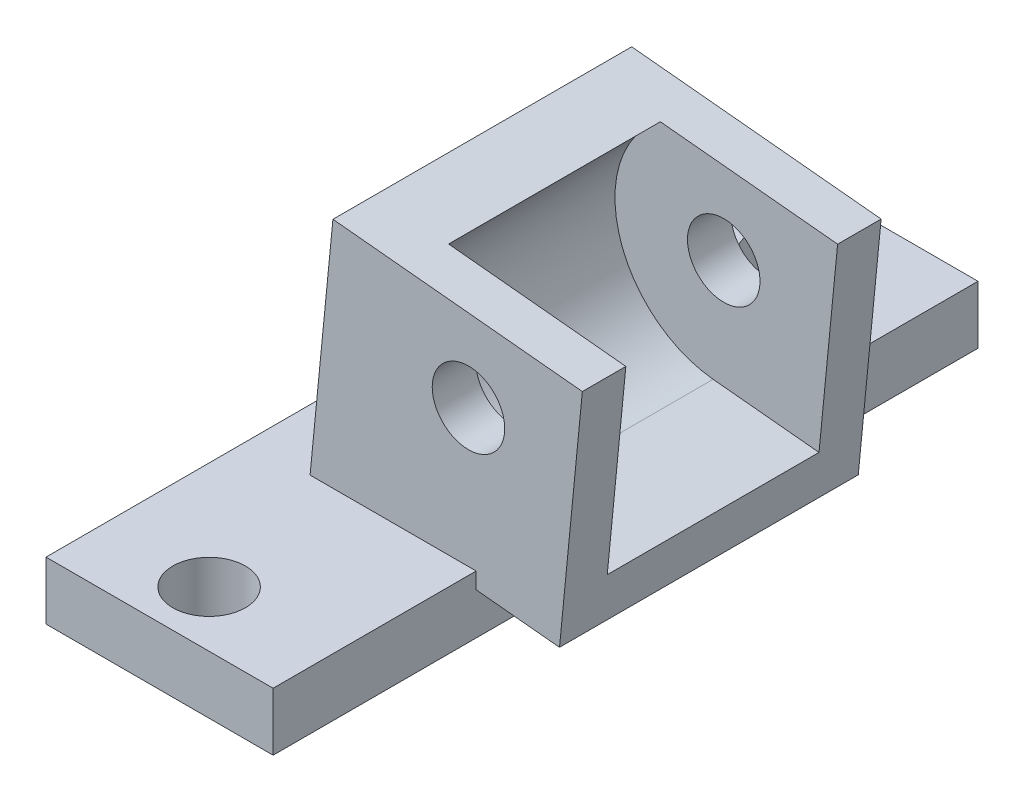
ISO-10303-21;
HEADER;
FILE_DESCRIPTION(('STEP AP214'),'2;1');
FILE_NAME('part.step','',(''),(''),'','','');
FILE_SCHEMA(('AUTOMOTIVE_DESIGN { 1 0 10303 214 1 1 1 1 }'));
ENDSEC;
DATA;
#1=APPLICATION_CONTEXT('core data for automotive mechanical design processes');
#2=APPLICATION_PROTOCOL_DEFINITION('international standard','automotive_design',2000,#1);
#3=PRODUCT_CONTEXT('',#1,'mechanical');
#4=PRODUCT('Part','Part','',(#3));
#5=PRODUCT_RELATED_PRODUCT_CATEGORY('part','',(#4));
#6=PRODUCT_DEFINITION_FORMATION('','',#4);
#7=PRODUCT_DEFINITION_CONTEXT('part definition',#1,'design');
#8=PRODUCT_DEFINITION('design','',#6,#7);
#9=PRODUCT_DEFINITION_SHAPE('','',#8);
#10=(LENGTH_UNIT() NAMED_UNIT(*) SI_UNIT(.MILLI.,.METRE.));
#11=(NAMED_UNIT(*) PLANE_ANGLE_UNIT() SI_UNIT($,.RADIAN.));
#12=(NAMED_UNIT(*) SI_UNIT($,.STERADIAN.) SOLID_ANGLE_UNIT());
#13=UNCERTAINTY_MEASURE_WITH_UNIT(LENGTH_MEASURE(1.E-05),#10,'distance_accuracy_value','');
#14=(GEOMETRIC_REPRESENTATION_CONTEXT(3) GLOBAL_UNCERTAINTY_ASSIGNED_CONTEXT((#13)) GLOBAL_UNIT_ASSIGNED_CONTEXT((#10,
#11,#12)) REPRESENTATION_CONTEXT('',''));
#15=CARTESIAN_POINT('',(0.,0.,0.));
#16=DIRECTION('',(0.,0.,1.));
#17=DIRECTION('',(1.,0.,0.));
#18=AXIS2_PLACEMENT_3D('',#15,#16,#17);
#19=CARTESIAN_POINT('',(-484.354931301938,150.999999999998,-22.352));
#20=DIRECTION('',(0.,0.,1.));
#21=DIRECTION('',(1.,0.,0.));
#22=AXIS2_PLACEMENT_3D('',#19,#20,#21);
#23=CYLINDRICAL_SURFACE('',#22,9.525);
#24=CARTESIAN_POINT('',(-484.354931301938,150.999999999998,-18.542));
#25=DIRECTION('',(0.,0.,-1.));
#26=DIRECTION('',(-1.,0.,0.));
#27=AXIS2_PLACEMENT_3D('',#24,#25,#26);
#28=CIRCLE('',#27,9.525);
#29=CARTESIAN_POINT('',(-489.904354663161,158.741416237219,-18.542));
#30=VERTEX_POINT('',#29);
#31=CARTESIAN_POINT('',(-485.284620904234,141.520479851626,-18.542));
#32=VERTEX_POINT('',#31);
#33=EDGE_CURVE('E263',#30,#32,#28,.F.);
#34=ORIENTED_EDGE('',*,*,#33,.F.);
#35=DIRECTION('',(0.,0.,1.));
#36=VECTOR('',#35,1.);
#37=CARTESIAN_POINT('',(-489.904354663161,158.741416237219,-22.352));
#38=LINE('',#37,#36);
#39=CARTESIAN_POINT('',(-489.904354663163,158.741416237217,0.));
#40=VERTEX_POINT('',#39);
#41=EDGE_CURVE('E287',#30,#40,#38,.T.);
#42=ORIENTED_EDGE('',*,*,#41,.T.);
#43=CARTESIAN_POINT('',(-484.354931301938,150.999999999998,0.));
#44=DIRECTION('',(0.,0.,1.));
#45=DIRECTION('',(1.,0.,0.));
#46=AXIS2_PLACEMENT_3D('',#43,#44,#45);
#47=CIRCLE('',#46,9.525);
#48=CARTESIAN_POINT('',(-485.284620904234,141.520479851626,0.));
#49=VERTEX_POINT('',#48);
#50=EDGE_CURVE('E273',#40,#49,#47,.T.);
#51=ORIENTED_EDGE('',*,*,#50,.T.);
#52=DIRECTION('',(0.,0.,1.));
#53=VECTOR('',#52,1.);
#54=CARTESIAN_POINT('',(-485.284620904234,141.520479851626,-22.352));
#55=LINE('',#54,#53);
#56=EDGE_CURVE('E294',#32,#49,#55,.T.);
#57=ORIENTED_EDGE('',*,*,#56,.F.);
#58=EDGE_LOOP('',(#34,#42,#51,#57));
#59=FACE_BOUND('',#58,.T.);
#60=ADVANCED_FACE('F47',(#59),#23,.F.);
#61=CARTESIAN_POINT('',(9.12398287906905,93.0321037493761,-22.352));
#62=DIRECTION('',(-0.0976052075901477,-0.995225212427461,0.));
#63=DIRECTION('',(0.995225212427461,-0.0976052075901477,0.));
#64=AXIS2_PLACEMENT_3D('',#61,#62,#63);
#65=PLANE('',#64);
#66=DIRECTION('',(0.995225212427461,-0.0976052075901477,0.));
#67=VECTOR('',#66,1.);
#68=CARTESIAN_POINT('',(9.12398287906905,93.0321037493761,-18.542));
#69=LINE('',#68,#67);
#70=CARTESIAN_POINT('',(-476.012545359688,140.611135065123,-18.542));
#71=VERTEX_POINT('',#70);
#72=EDGE_CURVE('E260',#32,#71,#69,.T.);
#73=ORIENTED_EDGE('',*,*,#72,.F.);
#74=ORIENTED_EDGE('',*,*,#56,.T.);
#75=DIRECTION('',(0.995225212427461,-0.0976052075901477,0.));
#76=VECTOR('',#75,1.);
#77=CARTESIAN_POINT('',(9.12398287906905,93.0321037493761,0.));
#78=LINE('',#77,#76);
#79=CARTESIAN_POINT('',(-476.012545359688,140.611135065123,0.));
#80=VERTEX_POINT('',#79);
#81=EDGE_CURVE('E278',#49,#80,#78,.T.);
#82=ORIENTED_EDGE('',*,*,#81,.T.);
#83=DIRECTION('',(0.,0.,1.));
#84=VECTOR('',#83,1.);
#85=CARTESIAN_POINT('',(-476.012545359688,140.611135065123,-22.352));
#86=LINE('',#85,#84);
#87=EDGE_CURVE('E298',#71,#80,#86,.T.);
#88=ORIENTED_EDGE('',*,*,#87,.F.);
#89=EDGE_LOOP('',(#73,#74,#82,#88));
#90=FACE_BOUND('',#89,.T.);
#91=ADVANCED_FACE('F369',(#90),#65,.F.);
#92=CARTESIAN_POINT('',(-485.136528238757,47.5790313157485,-22.352));
#93=DIRECTION('',(-0.995225212427461,0.0976052075901501,0.));
#94=DIRECTION('',(-0.0976052075901501,-0.995225212427461,0.));
#95=AXIS2_PLACEMENT_3D('',#92,#93,#94);
#96=PLANE('',#95);
#97=ORIENTED_EDGE('',*,*,#87,.T.);
#98=DIRECTION('',(0.0976052075901513,0.99522521242746,0.));
#99=VECTOR('',#98,1.);
#100=CARTESIAN_POINT('',(-485.136528238757,47.5790313157491,0.));
#101=LINE('',#100,#99);
#102=CARTESIAN_POINT('',(-474.383729176465,157.219254365064,0.));
#103=VERTEX_POINT('',#102);
#104=EDGE_CURVE('E240',#80,#103,#101,.T.);
#105=ORIENTED_EDGE('',*,*,#104,.T.);
#106=DIRECTION('',(0.,0.,-1.));
#107=VECTOR('',#106,1.);
#108=CARTESIAN_POINT('',(-474.383729176465,157.219254365064,3.81));
#109=LINE('',#108,#107);
#110=CARTESIAN_POINT('',(-474.383729176465,157.219254365064,3.81));
#111=VERTEX_POINT('',#110);
#112=EDGE_CURVE('E236',#111,#103,#109,.T.);
#113=ORIENTED_EDGE('',*,*,#112,.F.);
#114=DIRECTION('',(0.0976052075901513,0.99522521242746,0.));
#115=VECTOR('',#114,1.);
#116=CARTESIAN_POINT('',(-485.136528238757,47.5790313157491,3.81));
#117=LINE('',#116,#115);
#118=CARTESIAN_POINT('',(-476.384421200606,136.819327005775,3.81));
#119=VERTEX_POINT('',#118);
#120=EDGE_CURVE('E229',#119,#111,#117,.T.);
#121=ORIENTED_EDGE('',*,*,#120,.F.);
#122=DIRECTION('',(0.,0.,1.));
#123=VECTOR('',#122,1.);
#124=CARTESIAN_POINT('',(-476.384421200606,136.819327005775,-22.352));
#125=LINE('',#124,#123);
#126=CARTESIAN_POINT('',(-476.384421200606,136.819327005775,-22.352));
#127=VERTEX_POINT('',#126);
#128=EDGE_CURVE('E302',#127,#119,#125,.T.);
#129=ORIENTED_EDGE('',*,*,#128,.F.);
#130=DIRECTION('',(-0.0976052075901501,-0.99522521242746,0.));
#131=VECTOR('',#130,1.);
#132=CARTESIAN_POINT('',(-485.136528238757,47.5790313157485,-22.352));
#133=LINE('',#132,#131);
#134=CARTESIAN_POINT('',(-474.383729176465,157.219254365064,-22.352));
#135=VERTEX_POINT('',#134);
#136=EDGE_CURVE('E284',#135,#127,#133,.T.);
#137=ORIENTED_EDGE('',*,*,#136,.F.);
#138=DIRECTION('',(0.,0.,-1.));
#139=VECTOR('',#138,1.);
#140=CARTESIAN_POINT('',(-474.383729176465,157.219254365064,-18.542));
#141=LINE('',#140,#139);
#142=CARTESIAN_POINT('',(-474.383729176465,157.219254365064,-18.542));
#143=VERTEX_POINT('',#142);
#144=EDGE_CURVE('E266',#143,#135,#141,.T.);
#145=ORIENTED_EDGE('',*,*,#144,.F.);
#146=DIRECTION('',(0.0976052075901519,0.99522521242746,0.));
#147=VECTOR('',#146,1.);
#148=CARTESIAN_POINT('',(-485.136528238757,47.5790313157494,-18.542));
#149=LINE('',#148,#147);
#150=EDGE_CURVE('E257',#71,#143,#149,.T.);
#151=ORIENTED_EDGE('',*,*,#150,.F.);
#152=EDGE_LOOP('',(#97,#105,#113,#121,#129,#137,#145,#151));
#153=FACE_BOUND('',#152,.T.);
#154=ADVANCED_FACE('F375',(#153),#96,.F.);
#155=CARTESIAN_POINT('',(8.75210703815075,89.2402956900255,-22.352));
#156=DIRECTION('',(0.0976052075901516,0.99522521242746,0.));
#157=DIRECTION('',(-0.99522521242746,0.0976052075901516,0.));
#158=AXIS2_PLACEMENT_3D('',#155,#156,#157);
#159=PLANE('',#158);
#160=DIRECTION('',(0.99522521242746,-0.0976052075901516,0.));
#161=VECTOR('',#160,1.);
#162=CARTESIAN_POINT('',(8.75210703815075,89.2402956900255,3.81));
#163=LINE('',#162,#161);
#164=CARTESIAN_POINT('',(-483.680863600713,137.534914559465,3.81));
#165=VERTEX_POINT('',#164);
#166=EDGE_CURVE('E226',#165,#119,#163,.T.);
#167=ORIENTED_EDGE('',*,*,#166,.F.);
#168=DIRECTION('',(0.,0.,-1.));
#169=VECTOR('',#168,1.);
#170=CARTESIAN_POINT('',(-483.680863600713,137.534914559465,-22.352));
#171=LINE('',#170,#169);
#172=CARTESIAN_POINT('',(-483.680863600713,137.534914559465,-22.352));
#173=VERTEX_POINT('',#172);
#174=EDGE_CURVE('E70',#165,#173,#171,.T.);
#175=ORIENTED_EDGE('',*,*,#174,.T.);
#176=DIRECTION('',(-0.99522521242746,0.0976052075901516,0.));
#177=VECTOR('',#176,1.);
#178=CARTESIAN_POINT('',(8.75210703815075,89.2402956900255,-22.352));
#179=LINE('',#178,#177);
#180=EDGE_CURVE('E281',#127,#173,#179,.T.);
#181=ORIENTED_EDGE('',*,*,#180,.F.);
#182=ORIENTED_EDGE('',*,*,#128,.T.);
#183=EDGE_LOOP('',(#167,#175,#181,#182));
#184=FACE_BOUND('',#183,.T.);
#185=ADVANCED_FACE('F406',(#184),#159,.F.);
#186=CARTESIAN_POINT('',(-506.976833824368,49.7209862560959,-22.352));
#187=DIRECTION('',(0.99522521242746,-0.097605207590153,0.));
#188=DIRECTION('',(0.097605207590153,0.99522521242746,0.));
#189=AXIS2_PLACEMENT_3D('',#186,#187,#188);
#190=PLANE('',#189);
#191=DIRECTION('',(0.,0.,1.));
#192=VECTOR('',#191,1.);
#193=CARTESIAN_POINT('',(-498.224726786217,138.961281946121,-22.352));
#194=LINE('',#193,#192);
#195=CARTESIAN_POINT('',(-498.224726786217,138.961281946121,-22.352));
#196=VERTEX_POINT('',#195);
#197=CARTESIAN_POINT('',(-498.224726786217,138.961281946121,3.81));
#198=VERTEX_POINT('',#197);
#199=EDGE_CURVE('E306',#196,#198,#194,.T.);
#200=ORIENTED_EDGE('',*,*,#199,.T.);
#201=DIRECTION('',(-0.097605207590153,-0.99522521242746,0.));
#202=VECTOR('',#201,1.);
#203=CARTESIAN_POINT('',(-506.976833824367,49.7209862560959,3.81));
#204=LINE('',#203,#202);
#205=CARTESIAN_POINT('',(-496.224034762075,159.361209305416,3.81));
#206=VERTEX_POINT('',#205);
#207=EDGE_CURVE('E222',#206,#198,#204,.T.);
#208=ORIENTED_EDGE('',*,*,#207,.F.);
#209=DIRECTION('',(0.,0.,1.));
#210=VECTOR('',#209,1.);
#211=CARTESIAN_POINT('',(-496.224034762075,159.361209305416,-22.352));
#212=LINE('',#211,#210);
#213=CARTESIAN_POINT('',(-496.224034762075,159.361209305416,-22.352));
#214=VERTEX_POINT('',#213);
#215=EDGE_CURVE('E310',#214,#206,#212,.T.);
#216=ORIENTED_EDGE('',*,*,#215,.F.);
#217=DIRECTION('',(0.097605207590153,0.99522521242746,0.));
#218=VECTOR('',#217,1.);
#219=CARTESIAN_POINT('',(-506.976833824368,49.7209862560959,-22.352));
#220=LINE('',#219,#218);
#221=EDGE_CURVE('E277',#196,#214,#220,.T.);
#222=ORIENTED_EDGE('',*,*,#221,.F.);
#223=EDGE_LOOP('',(#200,#208,#216,#222));
#224=FACE_BOUND('',#223,.T.);
#225=ADVANCED_FACE('F404',(#224),#190,.F.);
#226=CARTESIAN_POINT('',(10.752799062292,109.640223049322,-22.352));
#227=DIRECTION('',(-0.0976052075901493,-0.995225212427461,0.));
#228=DIRECTION('',(0.995225212427461,-0.0976052075901493,0.));
#229=AXIS2_PLACEMENT_3D('',#226,#227,#228);
#230=PLANE('',#229);
#231=ORIENTED_EDGE('',*,*,#215,.T.);
#232=DIRECTION('',(-0.995225212427434,0.0976052075904193,0.));
#233=VECTOR('',#232,1.);
#234=CARTESIAN_POINT('',(10.7527990623083,109.640223049182,3.81));
#235=LINE('',#234,#233);
#236=EDGE_CURVE('E218',#111,#206,#235,.T.);
#237=ORIENTED_EDGE('',*,*,#236,.F.);
#238=ORIENTED_EDGE('',*,*,#112,.T.);
#239=DIRECTION('',(-0.995225212427434,0.0976052075904193,0.));
#240=VECTOR('',#239,1.);
#241=CARTESIAN_POINT('',(10.7527990623083,109.640223049182,0.));
#242=LINE('',#241,#240);
#243=EDGE_CURVE('E217',#103,#40,#242,.T.);
#244=ORIENTED_EDGE('',*,*,#243,.T.);
#245=ORIENTED_EDGE('',*,*,#41,.F.);
#246=DIRECTION('',(-0.995225212427423,0.0976052075905285,0.));
#247=VECTOR('',#246,1.);
#248=CARTESIAN_POINT('',(10.7527990623151,109.640223049127,-18.542));
#249=LINE('',#248,#247);
#250=EDGE_CURVE('E254',#143,#30,#249,.T.);
#251=ORIENTED_EDGE('',*,*,#250,.F.);
#252=ORIENTED_EDGE('',*,*,#144,.T.);
#253=DIRECTION('',(0.995225212427461,-0.0976052075901493,0.));
#254=VECTOR('',#253,1.);
#255=CARTESIAN_POINT('',(10.752799062292,109.640223049322,-22.352));
#256=LINE('',#255,#254);
#257=EDGE_CURVE('E274',#214,#135,#256,.T.);
#258=ORIENTED_EDGE('',*,*,#257,.F.);
#259=EDGE_LOOP('',(#231,#237,#238,#244,#245,#251,#252,#258));
#260=FACE_BOUND('',#259,.T.);
#261=ADVANCED_FACE('F385',(#260),#230,.F.);
#262=CARTESIAN_POINT('',(0.,0.,-22.352));
#263=DIRECTION('',(0.,0.,1.));
#264=DIRECTION('',(1.,0.,0.));
#265=AXIS2_PLACEMENT_3D('',#262,#263,#264);
#266=PLANE('',#265);
#267=ORIENTED_EDGE('',*,*,#180,.T.);
#268=DIRECTION('',(0.,1.,0.));
#269=VECTOR('',#268,1.);
#270=CARTESIAN_POINT('',(-483.680863600713,-3.8951352806537E-13,-22.352));
#271=LINE('',#270,#269);
#272=CARTESIAN_POINT('',(-483.680863600713,138.961281946121,-22.352));
#273=VERTEX_POINT('',#272);
#274=EDGE_CURVE('E62',#173,#273,#271,.T.);
#275=ORIENTED_EDGE('',*,*,#274,.T.);
#276=DIRECTION('',(-1.,0.,0.));
#277=VECTOR('',#276,1.);
#278=CARTESIAN_POINT('',(-1.93945354162369E-13,138.961281946121,-22.352));
#279=LINE('',#278,#277);
#280=EDGE_CURVE('E204',#273,#196,#279,.T.);
#281=ORIENTED_EDGE('',*,*,#280,.T.);
#282=ORIENTED_EDGE('',*,*,#221,.T.);
#283=ORIENTED_EDGE('',*,*,#257,.T.);
#284=ORIENTED_EDGE('',*,*,#136,.T.);
#285=EDGE_LOOP('',(#267,#275,#281,#282,#283,#284));
#286=FACE_BOUND('',#285,.T.);
#287=CARTESIAN_POINT('',(-484.354931302,150.999999999998,-22.352));
#288=DIRECTION('',(0.,0.,-1.));
#289=DIRECTION('',(-1.,0.,0.));
#290=AXIS2_PLACEMENT_3D('',#287,#288,#289);
#291=CIRCLE('',#290,3.17499999994065);
#292=CARTESIAN_POINT('',(-487.529931301941,150.999999999998,-22.352));
#293=VERTEX_POINT('',#292);
#294=EDGE_CURVE('E249',#293,#293,#291,.T.);
#295=ORIENTED_EDGE('',*,*,#294,.F.);
#296=EDGE_LOOP('',(#295));
#297=FACE_BOUND('',#296,.T.);
#298=ADVANCED_FACE('F400',(#286,#297),#266,.F.);
#299=CARTESIAN_POINT('',(-484.354931302,150.999999999998,-18.542));
#300=DIRECTION('',(0.,0.,-1.));
#301=DIRECTION('',(-1.,0.,0.));
#302=AXIS2_PLACEMENT_3D('',#299,#300,#301);
#303=CYLINDRICAL_SURFACE('',#302,3.17499999994065);
#304=CARTESIAN_POINT('',(-484.354931302,150.999999999998,-18.542));
#305=DIRECTION('',(0.,0.,-1.));
#306=DIRECTION('',(-1.,0.,0.));
#307=AXIS2_PLACEMENT_3D('',#304,#305,#306);
#308=CIRCLE('',#307,3.17499999994065);
#309=CARTESIAN_POINT('',(-487.529931301941,150.999999999998,-18.542));
#310=VERTEX_POINT('',#309);
#311=EDGE_CURVE('E250',#310,#310,#308,.T.);
#312=CARTESIAN_POINT('',(-487.529931301941,150.999999999998,-18.542));
#313=CARTESIAN_POINT('',(-487.529931301941,150.999999999998,-18.5816875));
#314=CARTESIAN_POINT('',(-487.529931301941,150.999999999998,-18.621375));
#315=CARTESIAN_POINT('',(-487.529931301941,150.999999999998,-18.70075));
#316=CARTESIAN_POINT('',(-487.529931301941,150.999999999998,-18.7404375));
#317=CARTESIAN_POINT('',(-487.529931301941,150.999999999998,-18.8198125));
#318=CARTESIAN_POINT('',(-487.529931301941,150.999999999998,-18.8595));
#319=CARTESIAN_POINT('',(-487.529931301941,150.999999999998,-18.938875));
#320=CARTESIAN_POINT('',(-487.529931301941,150.999999999998,-18.9785625));
#321=CARTESIAN_POINT('',(-487.529931301941,150.999999999998,-19.0579375));
#322=CARTESIAN_POINT('',(-487.529931301941,150.999999999998,-19.097625));
#323=CARTESIAN_POINT('',(-487.529931301941,150.999999999998,-19.177));
#324=CARTESIAN_POINT('',(-487.529931301941,150.999999999998,-19.2166875));
#325=CARTESIAN_POINT('',(-487.529931301941,150.999999999998,-19.2960625));
#326=CARTESIAN_POINT('',(-487.529931301941,150.999999999998,-19.33575));
#327=CARTESIAN_POINT('',(-487.529931301941,150.999999999998,-19.415125));
#328=CARTESIAN_POINT('',(-487.529931301941,150.999999999998,-19.4548125));
#329=CARTESIAN_POINT('',(-487.529931301941,150.999999999998,-19.5341875));
#330=CARTESIAN_POINT('',(-487.529931301941,150.999999999998,-19.573875));
#331=CARTESIAN_POINT('',(-487.529931301941,150.999999999998,-19.65325));
#332=CARTESIAN_POINT('',(-487.529931301941,150.999999999998,-19.6929375));
#333=CARTESIAN_POINT('',(-487.529931301941,150.999999999998,-19.7723125));
#334=CARTESIAN_POINT('',(-487.529931301941,150.999999999998,-19.812));
#335=CARTESIAN_POINT('',(-487.529931301941,150.999999999998,-19.891375));
#336=CARTESIAN_POINT('',(-487.529931301941,150.999999999998,-19.9310625));
#337=CARTESIAN_POINT('',(-487.529931301941,150.999999999998,-20.0104375));
#338=CARTESIAN_POINT('',(-487.529931301941,150.999999999998,-20.050125));
#339=CARTESIAN_POINT('',(-487.529931301941,150.999999999998,-20.1295));
#340=CARTESIAN_POINT('',(-487.529931301941,150.999999999998,-20.1691875));
#341=CARTESIAN_POINT('',(-487.529931301941,150.999999999998,-20.2485625));
#342=CARTESIAN_POINT('',(-487.529931301941,150.999999999998,-20.28825));
#343=CARTESIAN_POINT('',(-487.529931301941,150.999999999998,-20.367625));
#344=CARTESIAN_POINT('',(-487.529931301941,150.999999999998,-20.4073125));
#345=CARTESIAN_POINT('',(-487.529931301941,150.999999999998,-20.4866875));
#346=CARTESIAN_POINT('',(-487.529931301941,150.999999999998,-20.526375));
#347=CARTESIAN_POINT('',(-487.529931301941,150.999999999998,-20.60575));
#348=CARTESIAN_POINT('',(-487.529931301941,150.999999999998,-20.6454375));
#349=CARTESIAN_POINT('',(-487.529931301941,150.999999999998,-20.7248125));
#350=CARTESIAN_POINT('',(-487.529931301941,150.999999999998,-20.7645));
#351=CARTESIAN_POINT('',(-487.529931301941,150.999999999998,-20.843875));
#352=CARTESIAN_POINT('',(-487.529931301941,150.999999999998,-20.8835625));
#353=CARTESIAN_POINT('',(-487.529931301941,150.999999999998,-20.9629375));
#354=CARTESIAN_POINT('',(-487.529931301941,150.999999999998,-21.002625));
#355=CARTESIAN_POINT('',(-487.529931301941,150.999999999998,-21.082));
#356=CARTESIAN_POINT('',(-487.529931301941,150.999999999998,-21.1216875));
#357=CARTESIAN_POINT('',(-487.529931301941,150.999999999998,-21.2010625));
#358=CARTESIAN_POINT('',(-487.529931301941,150.999999999998,-21.24075));
#359=CARTESIAN_POINT('',(-487.529931301941,150.999999999998,-21.320125));
#360=CARTESIAN_POINT('',(-487.529931301941,150.999999999998,-21.3598125));
#361=CARTESIAN_POINT('',(-487.529931301941,150.999999999998,-21.4391875));
#362=CARTESIAN_POINT('',(-487.529931301941,150.999999999998,-21.478875));
#363=CARTESIAN_POINT('',(-487.529931301941,150.999999999998,-21.55825));
#364=CARTESIAN_POINT('',(-487.529931301941,150.999999999998,-21.5979375));
#365=CARTESIAN_POINT('',(-487.529931301941,150.999999999998,-21.6773125));
#366=CARTESIAN_POINT('',(-487.529931301941,150.999999999998,-21.717));
#367=CARTESIAN_POINT('',(-487.529931301941,150.999999999998,-21.796375));
#368=CARTESIAN_POINT('',(-487.529931301941,150.999999999998,-21.8360625));
#369=CARTESIAN_POINT('',(-487.529931301941,150.999999999998,-21.9154375));
#370=CARTESIAN_POINT('',(-487.529931301941,150.999999999998,-21.955125));
#371=CARTESIAN_POINT('',(-487.529931301941,150.999999999998,-22.0345));
#372=CARTESIAN_POINT('',(-487.529931301941,150.999999999998,-22.0741875));
#373=CARTESIAN_POINT('',(-487.529931301941,150.999999999998,-22.1535625));
#374=CARTESIAN_POINT('',(-487.529931301941,150.999999999998,-22.19325));
#375=CARTESIAN_POINT('',(-487.529931301941,150.999999999998,-22.272625));
#376=CARTESIAN_POINT('',(-487.529931301941,150.999999999998,-22.3123125));
#377=CARTESIAN_POINT('',(-487.529931301941,150.999999999998,-22.352));
#378=B_SPLINE_CURVE_WITH_KNOTS('',3,(#312,#313,#314,#315,#316,#317,#318,#319,#320,#321,#322,
#323,#324,#325,#326,#327,#328,#329,#330,#331,#332,#333,#334,#335,#336,#337,#338,#339,#340,#341,
#342,#343,#344,#345,#346,#347,#348,#349,#350,#351,#352,#353,#354,#355,#356,#357,#358,#359,#360,
#361,#362,#363,#364,#365,#366,#367,#368,#369,#370,#371,#372,#373,#374,#375,#376,#377),
.UNSPECIFIED.,.F.,.F.,(4,2,2,2,2,2,2,2,2,2,2,2,2,2,2,2,2,2,2,2,2,2,2,2,2,2,2,2,2,2,2,2,4),(0.,
0.119062500000003,0.238125000000002,0.357187500000002,0.476250000000001,0.5953125,
0.714375000000003,0.833437500000003,0.952500000000002,1.0715625,1.190625,1.3096875,1.42875,
1.5478125,1.666875,1.7859375,1.905,2.0240625,2.143125,2.2621875,2.38125,2.5003125,2.619375,
2.7384375,2.8575,2.9765625,3.095625,3.2146875,3.33375,3.4528125,3.571875,3.6909375,3.81),.UNSPECIFIED.);
#379=EDGE_CURVE('BSEAM421',#310,#293,#378,.T.);
#380=ORIENTED_EDGE('',*,*,#311,.F.);
#381=ORIENTED_EDGE('',*,*,#294,.T.);
#382=ORIENTED_EDGE('',*,*,#379,.T.);
#383=ORIENTED_EDGE('',*,*,#379,.F.);
#384=EDGE_LOOP('',(#380,#382,#381,#383));
#385=FACE_BOUND('',#384,.T.);
#386=ADVANCED_FACE('F421',(#385),#303,.F.);
#387=CARTESIAN_POINT('',(0.,0.,-18.542));
#388=DIRECTION('',(0.,0.,-1.));
#389=DIRECTION('',(-1.,0.,0.));
#390=AXIS2_PLACEMENT_3D('',#387,#388,#389);
#391=PLANE('',#390);
#392=ORIENTED_EDGE('',*,*,#311,.T.);
#393=EDGE_LOOP('',(#392));
#394=FACE_BOUND('',#393,.T.);
#395=ORIENTED_EDGE('',*,*,#250,.T.);
#396=ORIENTED_EDGE('',*,*,#33,.T.);
#397=ORIENTED_EDGE('',*,*,#72,.T.);
#398=ORIENTED_EDGE('',*,*,#150,.T.);
#399=EDGE_LOOP('',(#395,#396,#397,#398));
#400=FACE_BOUND('',#399,.T.);
#401=ADVANCED_FACE('F393',(#394,#400),#391,.F.);
#402=CARTESIAN_POINT('',(-484.354931302,150.999999999998,3.81));
#403=DIRECTION('',(0.,0.,-1.));
#404=DIRECTION('',(-1.,0.,0.));
#405=AXIS2_PLACEMENT_3D('',#402,#403,#404);
#406=CYLINDRICAL_SURFACE('',#405,3.17500000005914);
#407=CARTESIAN_POINT('',(-484.354931302,150.999999999998,3.81));
#408=DIRECTION('',(0.,0.,1.));
#409=DIRECTION('',(1.,0.,0.));
#410=AXIS2_PLACEMENT_3D('',#407,#408,#409);
#411=CIRCLE('',#410,3.17500000005914);
#412=CARTESIAN_POINT('',(-487.529931302059,150.999999999998,3.81));
#413=VERTEX_POINT('',#412);
#414=EDGE_CURVE('E232',#413,#413,#411,.T.);
#415=CARTESIAN_POINT('',(-484.354931302,150.999999999998,0.));
#416=DIRECTION('',(0.,0.,1.));
#417=DIRECTION('',(1.,0.,0.));
#418=AXIS2_PLACEMENT_3D('',#415,#416,#417);
#419=CIRCLE('',#418,3.17500000005914);
#420=CARTESIAN_POINT('',(-487.529931302059,150.999999999998,0.));
#421=VERTEX_POINT('',#420);
#422=EDGE_CURVE('E223',#421,#421,#419,.T.);
#423=CARTESIAN_POINT('',(-487.529931302059,150.999999999998,3.81));
#424=CARTESIAN_POINT('',(-487.529931302059,150.999999999998,3.7703125));
#425=CARTESIAN_POINT('',(-487.529931302059,150.999999999998,3.730625));
#426=CARTESIAN_POINT('',(-487.529931302059,150.999999999998,3.65125));
#427=CARTESIAN_POINT('',(-487.529931302059,150.999999999998,3.6115625));
#428=CARTESIAN_POINT('',(-487.529931302059,150.999999999998,3.5321875));
#429=CARTESIAN_POINT('',(-487.529931302059,150.999999999998,3.4925));
#430=CARTESIAN_POINT('',(-487.529931302059,150.999999999998,3.413125));
#431=CARTESIAN_POINT('',(-487.529931302059,150.999999999998,3.3734375));
#432=CARTESIAN_POINT('',(-487.529931302059,150.999999999998,3.2940625));
#433=CARTESIAN_POINT('',(-487.529931302059,150.999999999998,3.254375));
#434=CARTESIAN_POINT('',(-487.529931302059,150.999999999998,3.175));
#435=CARTESIAN_POINT('',(-487.529931302059,150.999999999998,3.1353125));
#436=CARTESIAN_POINT('',(-487.529931302059,150.999999999998,3.0559375));
#437=CARTESIAN_POINT('',(-487.529931302059,150.999999999998,3.01625));
#438=CARTESIAN_POINT('',(-487.529931302059,150.999999999998,2.936875));
#439=CARTESIAN_POINT('',(-487.529931302059,150.999999999998,2.8971875));
#440=CARTESIAN_POINT('',(-487.529931302059,150.999999999998,2.8178125));
#441=CARTESIAN_POINT('',(-487.529931302059,150.999999999998,2.778125));
#442=CARTESIAN_POINT('',(-487.529931302059,150.999999999998,2.69875));
#443=CARTESIAN_POINT('',(-487.529931302059,150.999999999998,2.6590625));
#444=CARTESIAN_POINT('',(-487.529931302059,150.999999999998,2.5796875));
#445=CARTESIAN_POINT('',(-487.529931302059,150.999999999998,2.54));
#446=CARTESIAN_POINT('',(-487.529931302059,150.999999999998,2.460625));
#447=CARTESIAN_POINT('',(-487.529931302059,150.999999999998,2.4209375));
#448=CARTESIAN_POINT('',(-487.529931302059,150.999999999998,2.3415625));
#449=CARTESIAN_POINT('',(-487.529931302059,150.999999999998,2.301875));
#450=CARTESIAN_POINT('',(-487.529931302059,150.999999999998,2.2225));
#451=CARTESIAN_POINT('',(-487.529931302059,150.999999999998,2.1828125));
#452=CARTESIAN_POINT('',(-487.529931302059,150.999999999998,2.1034375));
#453=CARTESIAN_POINT('',(-487.529931302059,150.999999999998,2.06375));
#454=CARTESIAN_POINT('',(-487.529931302059,150.999999999998,1.984375));
#455=CARTESIAN_POINT('',(-487.529931302059,150.999999999998,1.9446875));
#456=CARTESIAN_POINT('',(-487.529931302059,150.999999999998,1.8653125));
#457=CARTESIAN_POINT('',(-487.529931302059,150.999999999998,1.825625));
#458=CARTESIAN_POINT('',(-487.529931302059,150.999999999998,1.74625));
#459=CARTESIAN_POINT('',(-487.529931302059,150.999999999998,1.7065625));
#460=CARTESIAN_POINT('',(-487.529931302059,150.999999999998,1.6271875));
#461=CARTESIAN_POINT('',(-487.529931302059,150.999999999998,1.5875));
#462=CARTESIAN_POINT('',(-487.529931302059,150.999999999998,1.508125));
#463=CARTESIAN_POINT('',(-487.529931302059,150.999999999998,1.4684375));
#464=CARTESIAN_POINT('',(-487.529931302059,150.999999999998,1.3890625));
#465=CARTESIAN_POINT('',(-487.529931302059,150.999999999998,1.349375));
#466=CARTESIAN_POINT('',(-487.529931302059,150.999999999998,1.27));
#467=CARTESIAN_POINT('',(-487.529931302059,150.999999999998,1.2303125));
#468=CARTESIAN_POINT('',(-487.529931302059,150.999999999998,1.1509375));
#469=CARTESIAN_POINT('',(-487.529931302059,150.999999999998,1.11125));
#470=CARTESIAN_POINT('',(-487.529931302059,150.999999999998,1.031875));
#471=CARTESIAN_POINT('',(-487.529931302059,150.999999999998,0.9921875));
#472=CARTESIAN_POINT('',(-487.529931302059,150.999999999998,0.9128125));
#473=CARTESIAN_POINT('',(-487.529931302059,150.999999999998,0.873125));
#474=CARTESIAN_POINT('',(-487.529931302059,150.999999999998,0.79375));
#475=CARTESIAN_POINT('',(-487.529931302059,150.999999999998,0.7540625));
#476=CARTESIAN_POINT('',(-487.529931302059,150.999999999998,0.6746875));
#477=CARTESIAN_POINT('',(-487.529931302059,150.999999999998,0.635));
#478=CARTESIAN_POINT('',(-487.529931302059,150.999999999998,0.555625));
#479=CARTESIAN_POINT('',(-487.529931302059,150.999999999998,0.5159375));
#480=CARTESIAN_POINT('',(-487.529931302059,150.999999999998,0.4365625));
#481=CARTESIAN_POINT('',(-487.529931302059,150.999999999998,0.396875));
#482=CARTESIAN_POINT('',(-487.529931302059,150.999999999998,0.3175));
#483=CARTESIAN_POINT('',(-487.529931302059,150.999999999998,0.2778125));
#484=CARTESIAN_POINT('',(-487.529931302059,150.999999999998,0.1984375));
#485=CARTESIAN_POINT('',(-487.529931302059,150.999999999998,0.15875));
#486=CARTESIAN_POINT('',(-487.529931302059,150.999999999998,0.0793749999999999));
#487=CARTESIAN_POINT('',(-487.529931302059,150.999999999998,0.0396874999999999));
#488=CARTESIAN_POINT('',(-487.529931302059,150.999999999998,0.));
#489=B_SPLINE_CURVE_WITH_KNOTS('',3,(#423,#424,#425,#426,#427,#428,#429,#430,#431,#432,#433,
#434,#435,#436,#437,#438,#439,#440,#441,#442,#443,#444,#445,#446,#447,#448,#449,#450,#451,#452,
#453,#454,#455,#456,#457,#458,#459,#460,#461,#462,#463,#464,#465,#466,#467,#468,#469,#470,#471,
#472,#473,#474,#475,#476,#477,#478,#479,#480,#481,#482,#483,#484,#485,#486,#487,#488),
.UNSPECIFIED.,.F.,.F.,(4,2,2,2,2,2,2,2,2,2,2,2,2,2,2,2,2,2,2,2,2,2,2,2,2,2,2,2,2,2,2,2,4),(0.,
0.1190625,0.238125,0.3571875,0.47625,0.595312499999999,0.714375,0.833437499999999,
0.952499999999999,1.0715625,1.190625,1.3096875,1.42875,1.5478125,1.666875,1.7859375,1.905,
2.0240625,2.143125,2.2621875,2.38125,2.5003125,2.619375,2.7384375,2.8575,2.9765625,3.095625,
3.2146875,3.33375,3.4528125,3.571875,3.6909375,3.81),.UNSPECIFIED.);
#490=EDGE_CURVE('BSEAM431',#413,#421,#489,.T.);
#491=ORIENTED_EDGE('',*,*,#414,.T.);
#492=ORIENTED_EDGE('',*,*,#422,.F.);
#493=ORIENTED_EDGE('',*,*,#490,.T.);
#494=ORIENTED_EDGE('',*,*,#490,.F.);
#495=EDGE_LOOP('',(#491,#493,#492,#494));
#496=FACE_BOUND('',#495,.T.);
#497=ADVANCED_FACE('F431',(#496),#406,.F.);
#498=CARTESIAN_POINT('',(0.,0.,3.81));
#499=DIRECTION('',(0.,0.,1.));
#500=DIRECTION('',(1.,0.,0.));
#501=AXIS2_PLACEMENT_3D('',#498,#499,#500);
#502=PLANE('',#501);
#503=DIRECTION('',(0.,1.,0.));
#504=VECTOR('',#503,1.);
#505=CARTESIAN_POINT('',(-483.680863600713,-3.8951352806537E-13,3.81));
#506=LINE('',#505,#504);
#507=CARTESIAN_POINT('',(-483.680863600713,138.961281946121,3.81));
#508=VERTEX_POINT('',#507);
#509=EDGE_CURVE('E11',#165,#508,#506,.T.);
#510=ORIENTED_EDGE('',*,*,#509,.F.);
#511=ORIENTED_EDGE('',*,*,#166,.T.);
#512=ORIENTED_EDGE('',*,*,#120,.T.);
#513=ORIENTED_EDGE('',*,*,#236,.T.);
#514=ORIENTED_EDGE('',*,*,#207,.T.);
#515=DIRECTION('',(-1.,0.,0.));
#516=VECTOR('',#515,1.);
#517=CARTESIAN_POINT('',(-1.93945354162369E-13,138.961281946121,3.81));
#518=LINE('',#517,#516);
#519=EDGE_CURVE('E55',#508,#198,#518,.T.);
#520=ORIENTED_EDGE('',*,*,#519,.F.);
#521=EDGE_LOOP('',(#510,#511,#512,#513,#514,#520));
#522=FACE_BOUND('',#521,.T.);
#523=ORIENTED_EDGE('',*,*,#414,.F.);
#524=EDGE_LOOP('',(#523));
#525=FACE_BOUND('',#524,.T.);
#526=ADVANCED_FACE('F322',(#522,#525),#502,.T.);
#527=CARTESIAN_POINT('',(0.,0.,0.));
#528=DIRECTION('',(0.,0.,1.));
#529=DIRECTION('',(1.,0.,0.));
#530=AXIS2_PLACEMENT_3D('',#527,#528,#529);
#531=PLANE('',#530);
#532=ORIENTED_EDGE('',*,*,#50,.F.);
#533=ORIENTED_EDGE('',*,*,#243,.F.);
#534=ORIENTED_EDGE('',*,*,#104,.F.);
#535=ORIENTED_EDGE('',*,*,#81,.F.);
#536=EDGE_LOOP('',(#532,#533,#534,#535));
#537=FACE_BOUND('',#536,.T.);
#538=ORIENTED_EDGE('',*,*,#422,.T.);
#539=EDGE_LOOP('',(#538));
#540=FACE_BOUND('',#539,.T.);
#541=ADVANCED_FACE('F363',(#537,#540),#531,.F.);
#542=CARTESIAN_POINT('',(-483.680863600713,133.881281946121,-40.132));
#543=DIRECTION('',(1.,0.,0.));
#544=DIRECTION('',(0.,1.,0.));
#545=AXIS2_PLACEMENT_3D('',#542,#543,#544);
#546=PLANE('',#545);
#547=ORIENTED_EDGE('',*,*,#274,.F.);
#548=ORIENTED_EDGE('',*,*,#174,.F.);
#549=ORIENTED_EDGE('',*,*,#509,.T.);
#550=DIRECTION('',(0.,0.,-1.));
#551=VECTOR('',#550,1.);
#552=CARTESIAN_POINT('',(-483.680863600713,138.961281946121,-40.132));
#553=LINE('',#552,#551);
#554=CARTESIAN_POINT('',(-483.680863600713,138.961281946121,21.59));
#555=VERTEX_POINT('',#554);
#556=EDGE_CURVE('E182',#555,#508,#553,.T.);
#557=ORIENTED_EDGE('',*,*,#556,.F.);
#558=DIRECTION('',(0.,1.,0.));
#559=VECTOR('',#558,1.);
#560=CARTESIAN_POINT('',(-483.680863600713,133.881281946121,21.59));
#561=LINE('',#560,#559);
#562=CARTESIAN_POINT('',(-483.680863600713,133.881281946121,21.59));
#563=VERTEX_POINT('',#562);
#564=EDGE_CURVE('E161',#563,#555,#561,.T.);
#565=ORIENTED_EDGE('',*,*,#564,.F.);
#566=DIRECTION('',(0.,0.,-1.));
#567=VECTOR('',#566,1.);
#568=CARTESIAN_POINT('',(-483.680863600713,133.881281946121,-40.132));
#569=LINE('',#568,#567);
#570=CARTESIAN_POINT('',(-483.680863600713,133.881281946121,-40.132));
#571=VERTEX_POINT('',#570);
#572=EDGE_CURVE('E172',#563,#571,#569,.T.);
#573=ORIENTED_EDGE('',*,*,#572,.T.);
#574=DIRECTION('',(0.,1.,0.));
#575=VECTOR('',#574,1.);
#576=CARTESIAN_POINT('',(-483.680863600713,133.881281946121,-40.132));
#577=LINE('',#576,#575);
#578=CARTESIAN_POINT('',(-483.680863600713,138.961281946121,-40.132));
#579=VERTEX_POINT('',#578);
#580=EDGE_CURVE('E205',#571,#579,#577,.T.);
#581=ORIENTED_EDGE('',*,*,#580,.T.);
#582=EDGE_CURVE('E198',#273,#579,#553,.T.);
#583=ORIENTED_EDGE('',*,*,#582,.F.);
#584=EDGE_LOOP('',(#547,#548,#549,#557,#565,#573,#581,#583));
#585=FACE_BOUND('',#584,.T.);
#586=ADVANCED_FACE('F326',(#585),#546,.T.);
#587=CARTESIAN_POINT('',(-1.93945354162369E-13,138.961281946121,3.74934419043482E-13));
#588=DIRECTION('',(0.,1.,0.));
#589=DIRECTION('',(0.,0.,1.));
#590=AXIS2_PLACEMENT_3D('',#587,#588,#589);
#591=PLANE('',#590);
#592=CARTESIAN_POINT('',(-494.16965277057,138.961281946121,16.7051930352712));
#593=DIRECTION('',(0.,1.,0.));
#594=DIRECTION('',(0.,0.,1.));
#595=AXIS2_PLACEMENT_3D('',#592,#593,#594);
#596=CIRCLE('',#595,3.17499999999997);
#597=CARTESIAN_POINT('',(-494.16965277057,138.961281946121,19.8801930352712));
#598=VERTEX_POINT('',#597);
#599=EDGE_CURVE('E333',#598,#598,#596,.T.);
#600=ORIENTED_EDGE('',*,*,#599,.F.);
#601=EDGE_LOOP('',(#600));
#602=FACE_BOUND('',#601,.T.);
#603=CARTESIAN_POINT('',(-494.16965277057,138.961281946121,-33.8362044244365));
#604=DIRECTION('',(0.,1.,0.));
#605=DIRECTION('',(0.,0.,1.));
#606=AXIS2_PLACEMENT_3D('',#603,#604,#605);
#607=CIRCLE('',#606,3.11259910496451);
#608=CARTESIAN_POINT('',(-494.16965277057,138.961281946121,-30.723605319472));
#609=VERTEX_POINT('',#608);
#610=EDGE_CURVE('E337',#609,#609,#607,.T.);
#611=ORIENTED_EDGE('',*,*,#610,.F.);
#612=EDGE_LOOP('',(#611));
#613=FACE_BOUND('',#612,.T.);
#614=ORIENTED_EDGE('',*,*,#280,.F.);
#615=ORIENTED_EDGE('',*,*,#582,.T.);
#616=DIRECTION('',(-1.,0.,0.));
#617=VECTOR('',#616,1.);
#618=CARTESIAN_POINT('',(-503.56765277057,138.961281946121,-40.132));
#619=LINE('',#618,#617);
#620=CARTESIAN_POINT('',(-503.56765277057,138.961281946121,-40.132));
#621=VERTEX_POINT('',#620);
#622=EDGE_CURVE('E178',#579,#621,#619,.T.);
#623=ORIENTED_EDGE('',*,*,#622,.T.);
#624=DIRECTION('',(0.,0.,1.));
#625=VECTOR('',#624,1.);
#626=CARTESIAN_POINT('',(-503.56765277057,138.961281946121,-40.132));
#627=LINE('',#626,#625);
#628=CARTESIAN_POINT('',(-503.56765277057,138.961281946121,21.59));
#629=VERTEX_POINT('',#628);
#630=EDGE_CURVE('E192',#621,#629,#627,.T.);
#631=ORIENTED_EDGE('',*,*,#630,.T.);
#632=DIRECTION('',(1.,0.,0.));
#633=VECTOR('',#632,1.);
#634=CARTESIAN_POINT('',(-503.56765277057,138.961281946121,21.59));
#635=LINE('',#634,#633);
#636=EDGE_CURVE('E155',#629,#555,#635,.T.);
#637=ORIENTED_EDGE('',*,*,#636,.T.);
#638=ORIENTED_EDGE('',*,*,#556,.T.);
#639=ORIENTED_EDGE('',*,*,#519,.T.);
#640=ORIENTED_EDGE('',*,*,#199,.F.);
#641=EDGE_LOOP('',(#614,#615,#623,#631,#637,#638,#639,#640));
#642=FACE_BOUND('',#641,.T.);
#643=ADVANCED_FACE('F319',(#602,#613,#642),#591,.T.);
#644=CARTESIAN_POINT('',(-503.56765277057,133.881281946121,-40.132));
#645=DIRECTION('',(-1.,0.,0.));
#646=DIRECTION('',(0.,-1.,0.));
#647=AXIS2_PLACEMENT_3D('',#644,#645,#646);
#648=PLANE('',#647);
#649=ORIENTED_EDGE('',*,*,#630,.F.);
#650=DIRECTION('',(0.,1.,0.));
#651=VECTOR('',#650,1.);
#652=CARTESIAN_POINT('',(-503.56765277057,133.881281946121,-40.132));
#653=LINE('',#652,#651);
#654=CARTESIAN_POINT('',(-503.56765277057,133.881281946121,-40.132));
#655=VERTEX_POINT('',#654);
#656=EDGE_CURVE('E176',#655,#621,#653,.T.);
#657=ORIENTED_EDGE('',*,*,#656,.F.);
#658=DIRECTION('',(0.,0.,1.));
#659=VECTOR('',#658,1.);
#660=CARTESIAN_POINT('',(-503.56765277057,133.881281946121,-40.132));
#661=LINE('',#660,#659);
#662=CARTESIAN_POINT('',(-503.56765277057,133.881281946121,21.59));
#663=VERTEX_POINT('',#662);
#664=EDGE_CURVE('E169',#655,#663,#661,.T.);
#665=ORIENTED_EDGE('',*,*,#664,.T.);
#666=DIRECTION('',(0.,1.,0.));
#667=VECTOR('',#666,1.);
#668=CARTESIAN_POINT('',(-503.56765277057,133.881281946121,21.59));
#669=LINE('',#668,#667);
#670=EDGE_CURVE('E150',#663,#629,#669,.T.);
#671=ORIENTED_EDGE('',*,*,#670,.T.);
#672=EDGE_LOOP('',(#649,#657,#665,#671));
#673=FACE_BOUND('',#672,.T.);
#674=ADVANCED_FACE('F175',(#673),#648,.T.);
#675=CARTESIAN_POINT('',(-503.56765277057,133.881281946121,-40.132));
#676=DIRECTION('',(0.,0.,-1.));
#677=DIRECTION('',(0.,1.,0.));
#678=AXIS2_PLACEMENT_3D('',#675,#676,#677);
#679=PLANE('',#678);
#680=ORIENTED_EDGE('',*,*,#622,.F.);
#681=ORIENTED_EDGE('',*,*,#580,.F.);
#682=DIRECTION('',(-1.,0.,0.));
#683=VECTOR('',#682,1.);
#684=CARTESIAN_POINT('',(-503.56765277057,133.881281946121,-40.132));
#685=LINE('',#684,#683);
#686=EDGE_CURVE('E162',#571,#655,#685,.T.);
#687=ORIENTED_EDGE('',*,*,#686,.T.);
#688=ORIENTED_EDGE('',*,*,#656,.T.);
#689=EDGE_LOOP('',(#680,#681,#687,#688));
#690=FACE_BOUND('',#689,.T.);
#691=ADVANCED_FACE('F360',(#690),#679,.T.);
#692=CARTESIAN_POINT('',(-503.56765277057,133.881281946121,21.59));
#693=DIRECTION('',(0.,0.,1.));
#694=DIRECTION('',(0.,-1.,0.));
#695=AXIS2_PLACEMENT_3D('',#692,#693,#694);
#696=PLANE('',#695);
#697=ORIENTED_EDGE('',*,*,#636,.F.);
#698=ORIENTED_EDGE('',*,*,#670,.F.);
#699=DIRECTION('',(1.,0.,0.));
#700=VECTOR('',#699,1.);
#701=CARTESIAN_POINT('',(-503.56765277057,133.881281946121,21.59));
#702=LINE('',#701,#700);
#703=EDGE_CURVE('E153',#663,#563,#702,.T.);
#704=ORIENTED_EDGE('',*,*,#703,.T.);
#705=ORIENTED_EDGE('',*,*,#564,.T.);
#706=EDGE_LOOP('',(#697,#698,#704,#705));
#707=FACE_BOUND('',#706,.T.);
#708=ADVANCED_FACE('F152',(#707),#696,.T.);
#709=CARTESIAN_POINT('',(-1.89854374197105E-13,133.881281946121,3.60826895074694E-13));
#710=DIRECTION('',(0.,1.,0.));
#711=DIRECTION('',(0.,0.,1.));
#712=AXIS2_PLACEMENT_3D('',#709,#710,#711);
#713=PLANE('',#712);
#714=CARTESIAN_POINT('',(-494.16965277057,133.881281946121,16.7051930352712));
#715=DIRECTION('',(0.,1.,0.));
#716=DIRECTION('',(0.,0.,1.));
#717=AXIS2_PLACEMENT_3D('',#714,#715,#716);
#718=CIRCLE('',#717,3.17499999999997);
#719=CARTESIAN_POINT('',(-494.16965277057,133.881281946121,19.8801930352712));
#720=VERTEX_POINT('',#719);
#721=EDGE_CURVE('E195',#720,#720,#718,.T.);
#722=ORIENTED_EDGE('',*,*,#721,.T.);
#723=EDGE_LOOP('',(#722));
#724=FACE_BOUND('',#723,.T.);
#725=CARTESIAN_POINT('',(-494.16965277057,133.881281946121,-33.8362044244366));
#726=DIRECTION('',(0.,1.,0.));
#727=DIRECTION('',(0.,0.,1.));
#728=AXIS2_PLACEMENT_3D('',#725,#726,#727);
#729=CIRCLE('',#728,3.11259910496451);
#730=CARTESIAN_POINT('',(-494.16965277057,133.881281946121,-30.723605319472));
#731=VERTEX_POINT('',#730);
#732=EDGE_CURVE('E185',#731,#731,#729,.T.);
#733=ORIENTED_EDGE('',*,*,#732,.T.);
#734=EDGE_LOOP('',(#733));
#735=FACE_BOUND('',#734,.T.);
#736=ORIENTED_EDGE('',*,*,#664,.F.);
#737=ORIENTED_EDGE('',*,*,#686,.F.);
#738=ORIENTED_EDGE('',*,*,#572,.F.);
#739=ORIENTED_EDGE('',*,*,#703,.F.);
#740=EDGE_LOOP('',(#736,#737,#738,#739));
#741=FACE_BOUND('',#740,.T.);
#742=ADVANCED_FACE('F167',(#724,#735,#741),#713,.F.);
#743=CARTESIAN_POINT('',(-494.16965277057,133.881281946121,-33.8362044244366));
#744=DIRECTION('',(0.,1.,0.));
#745=DIRECTION('',(0.,0.,1.));
#746=AXIS2_PLACEMENT_3D('',#743,#744,#745);
#747=CYLINDRICAL_SURFACE('',#746,3.11259910496451);
#748=ORIENTED_EDGE('',*,*,#732,.F.);
#749=EDGE_LOOP('',(#748));
#750=FACE_BOUND('',#749,.T.);
#751=ORIENTED_EDGE('',*,*,#610,.T.);
#752=EDGE_LOOP('',(#751));
#753=FACE_BOUND('',#752,.T.);
#754=ADVANCED_FACE('F345',(#750,#753),#747,.F.);
#755=CARTESIAN_POINT('',(-494.16965277057,133.881281946121,16.7051930352712));
#756=DIRECTION('',(0.,1.,0.));
#757=DIRECTION('',(0.,0.,1.));
#758=AXIS2_PLACEMENT_3D('',#755,#756,#757);
#759=CYLINDRICAL_SURFACE('',#758,3.17499999999997);
#760=ORIENTED_EDGE('',*,*,#721,.F.);
#761=EDGE_LOOP('',(#760));
#762=FACE_BOUND('',#761,.T.);
#763=ORIENTED_EDGE('',*,*,#599,.T.);
#764=EDGE_LOOP('',(#763));
#765=FACE_BOUND('',#764,.T.);
#766=ADVANCED_FACE('F348',(#762,#765),#759,.F.);
#767=CLOSED_SHELL('',(#60,#91,#154,#185,#225,#261,#298,#386,#401,#497,#526,#541,#586,#643,#674,
#691,#708,#742,#754,#766));
#768=MANIFOLD_SOLID_BREP('B2',#767);
#769=ADVANCED_BREP_SHAPE_REPRESENTATION('',(#18,#768),#14);
#770=SHAPE_DEFINITION_REPRESENTATION(#9,#769);
ENDSEC;
END-ISO-10303-21;
